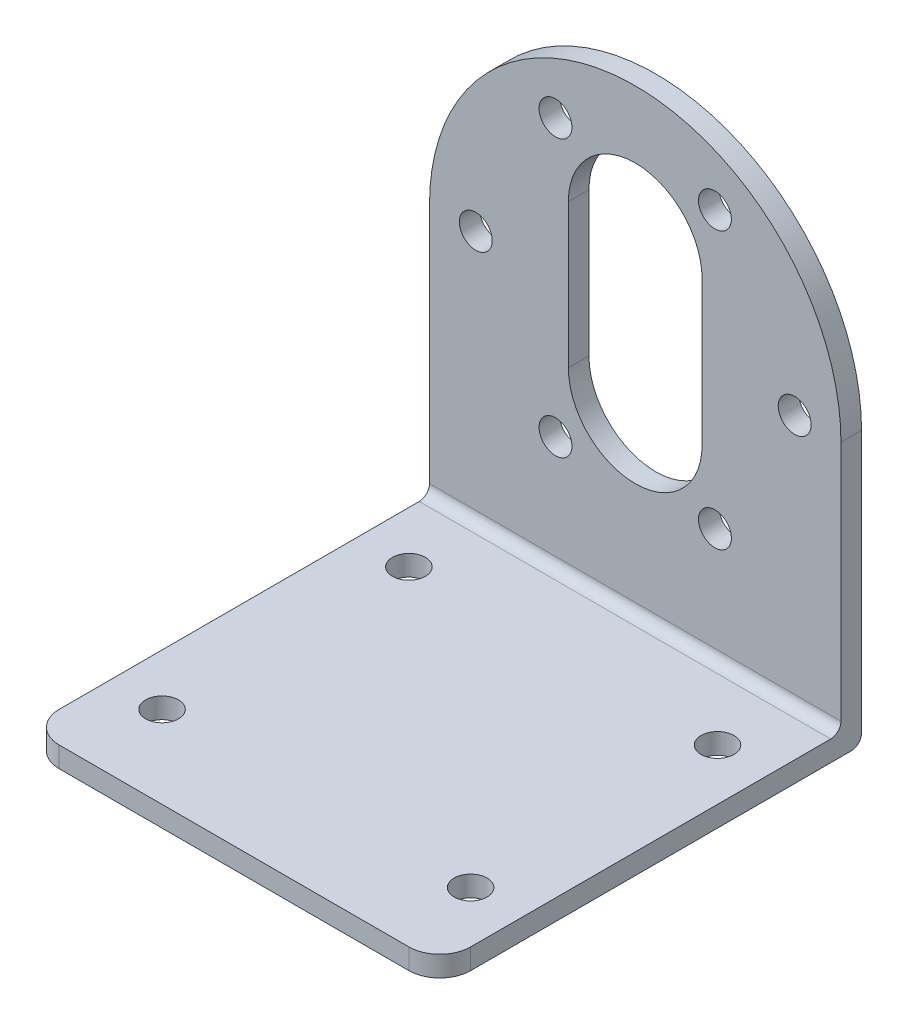
ISO-10303-21;
HEADER;
FILE_DESCRIPTION(('STEP AP214'),'2;1');
FILE_NAME('part.step','',(''),(''),'','','');
FILE_SCHEMA(('AUTOMOTIVE_DESIGN { 1 0 10303 214 1 1 1 1 }'));
ENDSEC;
DATA;
#1=APPLICATION_CONTEXT('core data for automotive mechanical design processes');
#2=APPLICATION_PROTOCOL_DEFINITION('international standard','automotive_design',2000,#1);
#3=PRODUCT_CONTEXT('',#1,'mechanical');
#4=PRODUCT('Part','Part','',(#3));
#5=PRODUCT_RELATED_PRODUCT_CATEGORY('part','',(#4));
#6=PRODUCT_DEFINITION_FORMATION('','',#4);
#7=PRODUCT_DEFINITION_CONTEXT('part definition',#1,'design');
#8=PRODUCT_DEFINITION('design','',#6,#7);
#9=PRODUCT_DEFINITION_SHAPE('','',#8);
#10=(LENGTH_UNIT() NAMED_UNIT(*) SI_UNIT(.MILLI.,.METRE.));
#11=(NAMED_UNIT(*) PLANE_ANGLE_UNIT() SI_UNIT($,.RADIAN.));
#12=(NAMED_UNIT(*) SI_UNIT($,.STERADIAN.) SOLID_ANGLE_UNIT());
#13=UNCERTAINTY_MEASURE_WITH_UNIT(LENGTH_MEASURE(1.E-05),#10,'distance_accuracy_value','');
#14=(GEOMETRIC_REPRESENTATION_CONTEXT(3) GLOBAL_UNCERTAINTY_ASSIGNED_CONTEXT((#13)) GLOBAL_UNIT_ASSIGNED_CONTEXT((#10,
#11,#12)) REPRESENTATION_CONTEXT('',''));
#15=CARTESIAN_POINT('',(0.,0.,0.));
#16=DIRECTION('',(0.,0.,1.));
#17=DIRECTION('',(1.,0.,0.));
#18=AXIS2_PLACEMENT_3D('',#15,#16,#17);
#19=CARTESIAN_POINT('',(0.,2.,0.));
#20=DIRECTION('',(0.,1.,0.));
#21=DIRECTION('',(0.,0.,1.));
#22=AXIS2_PLACEMENT_3D('',#19,#20,#21);
#23=PLANE('',#22);
#24=CARTESIAN_POINT('',(15.,2.,12.5));
#25=DIRECTION('',(0.,1.,0.));
#26=DIRECTION('',(0.,0.,1.));
#27=AXIS2_PLACEMENT_3D('',#24,#25,#26);
#28=CIRCLE('',#27,1.6);
#29=CARTESIAN_POINT('',(15.,2.,14.1));
#30=VERTEX_POINT('',#29);
#31=EDGE_CURVE('E184',#30,#30,#28,.T.);
#32=ORIENTED_EDGE('',*,*,#31,.F.);
#33=EDGE_LOOP('',(#32));
#34=FACE_BOUND('',#33,.T.);
#35=CARTESIAN_POINT('',(15.,2.,-11.5));
#36=DIRECTION('',(0.,1.,0.));
#37=DIRECTION('',(0.,0.,1.));
#38=AXIS2_PLACEMENT_3D('',#35,#36,#37);
#39=CIRCLE('',#38,1.6);
#40=CARTESIAN_POINT('',(15.,2.,-9.89999999999999));
#41=VERTEX_POINT('',#40);
#42=EDGE_CURVE('E191',#41,#41,#39,.T.);
#43=ORIENTED_EDGE('',*,*,#42,.F.);
#44=EDGE_LOOP('',(#43));
#45=FACE_BOUND('',#44,.T.);
#46=CARTESIAN_POINT('',(-15.,2.,-11.5));
#47=DIRECTION('',(0.,1.,0.));
#48=DIRECTION('',(0.,0.,1.));
#49=AXIS2_PLACEMENT_3D('',#46,#47,#48);
#50=CIRCLE('',#49,1.59999999999999);
#51=CARTESIAN_POINT('',(-15.,2.,-9.90000000000001));
#52=VERTEX_POINT('',#51);
#53=EDGE_CURVE('E187',#52,#52,#50,.T.);
#54=ORIENTED_EDGE('',*,*,#53,.F.);
#55=EDGE_LOOP('',(#54));
#56=FACE_BOUND('',#55,.T.);
#57=CARTESIAN_POINT('',(-15.,2.,12.5));
#58=DIRECTION('',(0.,1.,0.));
#59=DIRECTION('',(0.,0.,1.));
#60=AXIS2_PLACEMENT_3D('',#57,#58,#59);
#61=CIRCLE('',#60,1.6);
#62=CARTESIAN_POINT('',(-15.,2.,14.1));
#63=VERTEX_POINT('',#62);
#64=EDGE_CURVE('E190',#63,#63,#61,.T.);
#65=ORIENTED_EDGE('',*,*,#64,.F.);
#66=EDGE_LOOP('',(#65));
#67=FACE_BOUND('',#66,.T.);
#68=DIRECTION('',(0.,0.,-1.));
#69=VECTOR('',#68,1.);
#70=CARTESIAN_POINT('',(20.,2.,-20.5));
#71=LINE('',#70,#69);
#72=CARTESIAN_POINT('',(20.,2.,17.5));
#73=VERTEX_POINT('',#72);
#74=CARTESIAN_POINT('',(20.,2.,-17.5));
#75=VERTEX_POINT('',#74);
#76=EDGE_CURVE('E199',#73,#75,#71,.T.);
#77=ORIENTED_EDGE('',*,*,#76,.T.);
#78=DIRECTION('',(-1.,0.,0.));
#79=VECTOR('',#78,1.);
#80=CARTESIAN_POINT('',(0.,2.,-17.5));
#81=LINE('',#80,#79);
#82=CARTESIAN_POINT('',(-20.,2.,-17.5));
#83=VERTEX_POINT('',#82);
#84=EDGE_CURVE('E290',#75,#83,#81,.T.);
#85=ORIENTED_EDGE('',*,*,#84,.T.);
#86=DIRECTION('',(0.,0.,1.));
#87=VECTOR('',#86,1.);
#88=CARTESIAN_POINT('',(-20.,2.,-20.5));
#89=LINE('',#88,#87);
#90=CARTESIAN_POINT('',(-20.,2.,17.5));
#91=VERTEX_POINT('',#90);
#92=EDGE_CURVE('E202',#83,#91,#89,.T.);
#93=ORIENTED_EDGE('',*,*,#92,.T.);
#94=CARTESIAN_POINT('',(-17.,2.,17.5));
#95=DIRECTION('',(0.,1.,0.));
#96=DIRECTION('',(0.,0.,1.));
#97=AXIS2_PLACEMENT_3D('',#94,#95,#96);
#98=CIRCLE('',#97,3.);
#99=CARTESIAN_POINT('',(-17.,2.,20.5));
#100=VERTEX_POINT('',#99);
#101=EDGE_CURVE('E235',#91,#100,#98,.T.);
#102=ORIENTED_EDGE('',*,*,#101,.T.);
#103=DIRECTION('',(1.,0.,0.));
#104=VECTOR('',#103,1.);
#105=CARTESIAN_POINT('',(-20.,2.,20.5));
#106=LINE('',#105,#104);
#107=CARTESIAN_POINT('',(17.,2.,20.5));
#108=VERTEX_POINT('',#107);
#109=EDGE_CURVE('E205',#100,#108,#106,.T.);
#110=ORIENTED_EDGE('',*,*,#109,.T.);
#111=CARTESIAN_POINT('',(17.,2.,17.5));
#112=DIRECTION('',(0.,1.,0.));
#113=DIRECTION('',(0.,0.,1.));
#114=AXIS2_PLACEMENT_3D('',#111,#112,#113);
#115=CIRCLE('',#114,3.);
#116=EDGE_CURVE('E237',#108,#73,#115,.T.);
#117=ORIENTED_EDGE('',*,*,#116,.T.);
#118=EDGE_LOOP('',(#77,#85,#93,#102,#110,#117));
#119=FACE_BOUND('',#118,.T.);
#120=ADVANCED_FACE('F35',(#34,#45,#56,#67,#119),#23,.T.);
#121=CARTESIAN_POINT('',(20.,2.,-20.5));
#122=DIRECTION('',(-1.,0.,0.));
#123=DIRECTION('',(0.,0.,1.));
#124=AXIS2_PLACEMENT_3D('',#121,#122,#123);
#125=PLANE('',#124);
#126=DIRECTION('',(0.,0.,-1.));
#127=VECTOR('',#126,1.);
#128=CARTESIAN_POINT('',(20.,0.,-20.5));
#129=LINE('',#128,#127);
#130=CARTESIAN_POINT('',(20.,0.,17.5));
#131=VERTEX_POINT('',#130);
#132=CARTESIAN_POINT('',(20.,0.,-19.5));
#133=VERTEX_POINT('',#132);
#134=EDGE_CURVE('E209',#131,#133,#129,.T.);
#135=ORIENTED_EDGE('',*,*,#134,.T.);
#136=CARTESIAN_POINT('',(20.,1.,-19.5));
#137=DIRECTION('',(-1.,0.,0.));
#138=DIRECTION('',(0.,0.,1.));
#139=AXIS2_PLACEMENT_3D('',#136,#137,#138);
#140=CIRCLE('',#139,1.);
#141=CARTESIAN_POINT('',(20.,1.,-20.5));
#142=VERTEX_POINT('',#141);
#143=EDGE_CURVE('E288',#133,#142,#140,.F.);
#144=ORIENTED_EDGE('',*,*,#143,.T.);
#145=DIRECTION('',(0.,-1.,0.));
#146=VECTOR('',#145,1.);
#147=CARTESIAN_POINT('',(20.,2.,-20.5));
#148=LINE('',#147,#146);
#149=CARTESIAN_POINT('',(20.,26.5,-20.5));
#150=VERTEX_POINT('',#149);
#151=EDGE_CURVE('E219',#150,#142,#148,.T.);
#152=ORIENTED_EDGE('',*,*,#151,.F.);
#153=DIRECTION('',(0.,0.,-1.));
#154=VECTOR('',#153,1.);
#155=CARTESIAN_POINT('',(20.,26.5,-18.5));
#156=LINE('',#155,#154);
#157=CARTESIAN_POINT('',(20.,26.5,-18.5));
#158=VERTEX_POINT('',#157);
#159=EDGE_CURVE('E181',#158,#150,#156,.T.);
#160=ORIENTED_EDGE('',*,*,#159,.F.);
#161=DIRECTION('',(0.,-1.,0.));
#162=VECTOR('',#161,1.);
#163=CARTESIAN_POINT('',(20.,0.,-18.5));
#164=LINE('',#163,#162);
#165=CARTESIAN_POINT('',(20.,3.,-18.5));
#166=VERTEX_POINT('',#165);
#167=EDGE_CURVE('E171',#158,#166,#164,.T.);
#168=ORIENTED_EDGE('',*,*,#167,.T.);
#169=CARTESIAN_POINT('',(20.,3.,-17.5));
#170=DIRECTION('',(-1.,0.,0.));
#171=DIRECTION('',(0.,0.,1.));
#172=AXIS2_PLACEMENT_3D('',#169,#170,#171);
#173=CIRCLE('',#172,1.);
#174=EDGE_CURVE('E11',#166,#75,#173,.T.);
#175=ORIENTED_EDGE('',*,*,#174,.T.);
#176=ORIENTED_EDGE('',*,*,#76,.F.);
#177=DIRECTION('',(0.,-1.,0.));
#178=VECTOR('',#177,1.);
#179=CARTESIAN_POINT('',(20.,2.,17.5));
#180=LINE('',#179,#178);
#181=EDGE_CURVE('E222',#73,#131,#180,.T.);
#182=ORIENTED_EDGE('',*,*,#181,.T.);
#183=EDGE_LOOP('',(#135,#144,#152,#160,#168,#175,#176,#182));
#184=FACE_BOUND('',#183,.T.);
#185=ADVANCED_FACE('F315',(#184),#125,.F.);
#186=CARTESIAN_POINT('',(-20.,2.,-20.5));
#187=DIRECTION('',(0.,0.,1.));
#188=DIRECTION('',(1.,0.,0.));
#189=AXIS2_PLACEMENT_3D('',#186,#187,#188);
#190=PLANE('',#189);
#191=CARTESIAN_POINT('',(-7.75000000000015,13.0766062413413,-20.5));
#192=DIRECTION('',(0.,0.,-1.));
#193=DIRECTION('',(-0.50000000000001,-0.866025403784433,0.));
#194=AXIS2_PLACEMENT_3D('',#191,#192,#193);
#195=CIRCLE('',#194,1.6);
#196=CARTESIAN_POINT('',(-8.55000000000017,11.6909655952862,-20.5));
#197=VERTEX_POINT('',#196);
#198=EDGE_CURVE('E449',#197,#197,#195,.T.);
#199=ORIENTED_EDGE('',*,*,#198,.F.);
#200=EDGE_LOOP('',(#199));
#201=FACE_BOUND('',#200,.T.);
#202=CARTESIAN_POINT('',(7.74999999999988,13.0766062413411,-20.5));
#203=DIRECTION('',(0.,0.,-1.));
#204=DIRECTION('',(0.499999999999992,-0.866025403784443,0.));
#205=AXIS2_PLACEMENT_3D('',#202,#203,#204);
#206=CIRCLE('',#205,1.6);
#207=CARTESIAN_POINT('',(8.54999999999987,11.690965595286,-20.5));
#208=VERTEX_POINT('',#207);
#209=EDGE_CURVE('E452',#208,#208,#206,.T.);
#210=ORIENTED_EDGE('',*,*,#209,.F.);
#211=EDGE_LOOP('',(#210));
#212=FACE_BOUND('',#211,.T.);
#213=CARTESIAN_POINT('',(15.5,26.5,-20.5));
#214=DIRECTION('',(0.,0.,-1.));
#215=DIRECTION('',(1.,0.,0.));
#216=AXIS2_PLACEMENT_3D('',#213,#214,#215);
#217=CIRCLE('',#216,1.6);
#218=CARTESIAN_POINT('',(17.1,26.5,-20.5));
#219=VERTEX_POINT('',#218);
#220=EDGE_CURVE('E455',#219,#219,#217,.T.);
#221=ORIENTED_EDGE('',*,*,#220,.F.);
#222=EDGE_LOOP('',(#221));
#223=FACE_BOUND('',#222,.T.);
#224=CARTESIAN_POINT('',(7.75000000000007,39.9233937586588,-20.5));
#225=DIRECTION('',(0.,0.,-1.));
#226=DIRECTION('',(0.500000000000004,0.866025403784436,0.));
#227=AXIS2_PLACEMENT_3D('',#224,#225,#226);
#228=CIRCLE('',#227,1.6);
#229=CARTESIAN_POINT('',(8.55000000000008,41.3090344047139,-20.5));
#230=VERTEX_POINT('',#229);
#231=EDGE_CURVE('E429',#230,#230,#228,.T.);
#232=ORIENTED_EDGE('',*,*,#231,.F.);
#233=EDGE_LOOP('',(#232));
#234=FACE_BOUND('',#233,.T.);
#235=CARTESIAN_POINT('',(-7.74999999999996,39.9233937586588,-20.5));
#236=DIRECTION('',(0.,0.,-1.));
#237=DIRECTION('',(-0.499999999999998,0.86602540378444,0.));
#238=AXIS2_PLACEMENT_3D('',#235,#236,#237);
#239=CIRCLE('',#238,1.6);
#240=CARTESIAN_POINT('',(-8.54999999999996,41.3090344047139,-20.5));
#241=VERTEX_POINT('',#240);
#242=EDGE_CURVE('E270',#241,#241,#239,.T.);
#243=ORIENTED_EDGE('',*,*,#242,.F.);
#244=EDGE_LOOP('',(#243));
#245=FACE_BOUND('',#244,.T.);
#246=CARTESIAN_POINT('',(-15.5,26.5,-20.5));
#247=DIRECTION('',(0.,0.,-1.));
#248=DIRECTION('',(-1.,0.,0.));
#249=AXIS2_PLACEMENT_3D('',#246,#247,#248);
#250=CIRCLE('',#249,1.6);
#251=CARTESIAN_POINT('',(-17.1,26.5,-20.5));
#252=VERTEX_POINT('',#251);
#253=EDGE_CURVE('E265',#252,#252,#250,.T.);
#254=ORIENTED_EDGE('',*,*,#253,.F.);
#255=EDGE_LOOP('',(#254));
#256=FACE_BOUND('',#255,.T.);
#257=DIRECTION('',(0.,-1.,0.));
#258=VECTOR('',#257,1.);
#259=CARTESIAN_POINT('',(6.5,33.5,-20.5));
#260=LINE('',#259,#258);
#261=CARTESIAN_POINT('',(6.5,33.5,-20.5));
#262=VERTEX_POINT('',#261);
#263=CARTESIAN_POINT('',(6.5,19.5,-20.5));
#264=VERTEX_POINT('',#263);
#265=EDGE_CURVE('E151',#262,#264,#260,.T.);
#266=ORIENTED_EDGE('',*,*,#265,.F.);
#267=CARTESIAN_POINT('',(0.,33.5,-20.5));
#268=DIRECTION('',(0.,0.,-1.));
#269=DIRECTION('',(-1.,0.,0.));
#270=AXIS2_PLACEMENT_3D('',#267,#268,#269);
#271=CIRCLE('',#270,6.5);
#272=CARTESIAN_POINT('',(-6.5,33.5,-20.5));
#273=VERTEX_POINT('',#272);
#274=EDGE_CURVE('E156',#273,#262,#271,.T.);
#275=ORIENTED_EDGE('',*,*,#274,.F.);
#276=DIRECTION('',(0.,1.,0.));
#277=VECTOR('',#276,1.);
#278=CARTESIAN_POINT('',(-6.5,33.5,-20.5));
#279=LINE('',#278,#277);
#280=CARTESIAN_POINT('',(-6.5,19.5,-20.5));
#281=VERTEX_POINT('',#280);
#282=EDGE_CURVE('E161',#281,#273,#279,.T.);
#283=ORIENTED_EDGE('',*,*,#282,.F.);
#284=CARTESIAN_POINT('',(0.,19.5,-20.5));
#285=DIRECTION('',(0.,0.,-1.));
#286=DIRECTION('',(-1.,0.,0.));
#287=AXIS2_PLACEMENT_3D('',#284,#285,#286);
#288=CIRCLE('',#287,6.5);
#289=EDGE_CURVE('E140',#264,#281,#288,.T.);
#290=ORIENTED_EDGE('',*,*,#289,.F.);
#291=EDGE_LOOP('',(#266,#275,#283,#290));
#292=FACE_BOUND('',#291,.T.);
#293=ORIENTED_EDGE('',*,*,#151,.T.);
#294=DIRECTION('',(-1.,0.,0.));
#295=VECTOR('',#294,1.);
#296=CARTESIAN_POINT('',(-20.,1.,-20.5));
#297=LINE('',#296,#295);
#298=CARTESIAN_POINT('',(-20.,1.,-20.5));
#299=VERTEX_POINT('',#298);
#300=EDGE_CURVE('E261',#142,#299,#297,.T.);
#301=ORIENTED_EDGE('',*,*,#300,.T.);
#302=DIRECTION('',(0.,-1.,0.));
#303=VECTOR('',#302,1.);
#304=CARTESIAN_POINT('',(-20.,2.,-20.5));
#305=LINE('',#304,#303);
#306=CARTESIAN_POINT('',(-20.,26.5,-20.5));
#307=VERTEX_POINT('',#306);
#308=EDGE_CURVE('E208',#307,#299,#305,.T.);
#309=ORIENTED_EDGE('',*,*,#308,.F.);
#310=CARTESIAN_POINT('',(0.,26.5,-20.5));
#311=DIRECTION('',(0.,0.,-1.));
#312=DIRECTION('',(-1.,0.,0.));
#313=AXIS2_PLACEMENT_3D('',#310,#311,#312);
#314=CIRCLE('',#313,20.);
#315=EDGE_CURVE('E168',#307,#150,#314,.T.);
#316=ORIENTED_EDGE('',*,*,#315,.T.);
#317=EDGE_LOOP('',(#293,#301,#309,#316));
#318=FACE_BOUND('',#317,.T.);
#319=ADVANCED_FACE('F158',(#201,#212,#223,#234,#245,#256,#292,#318),#190,.F.);
#320=CARTESIAN_POINT('',(-20.,2.,-20.5));
#321=DIRECTION('',(1.,0.,0.));
#322=DIRECTION('',(0.,0.,-1.));
#323=AXIS2_PLACEMENT_3D('',#320,#321,#322);
#324=PLANE('',#323);
#325=ORIENTED_EDGE('',*,*,#308,.T.);
#326=CARTESIAN_POINT('',(-20.,1.,-19.5));
#327=DIRECTION('',(1.,0.,0.));
#328=DIRECTION('',(0.,0.,-1.));
#329=AXIS2_PLACEMENT_3D('',#326,#327,#328);
#330=CIRCLE('',#329,1.);
#331=CARTESIAN_POINT('',(-20.,0.,-19.5));
#332=VERTEX_POINT('',#331);
#333=EDGE_CURVE('E284',#299,#332,#330,.F.);
#334=ORIENTED_EDGE('',*,*,#333,.T.);
#335=DIRECTION('',(0.,0.,1.));
#336=VECTOR('',#335,1.);
#337=CARTESIAN_POINT('',(-20.,0.,-20.5));
#338=LINE('',#337,#336);
#339=CARTESIAN_POINT('',(-20.,0.,17.5));
#340=VERTEX_POINT('',#339);
#341=EDGE_CURVE('E212',#332,#340,#338,.T.);
#342=ORIENTED_EDGE('',*,*,#341,.T.);
#343=DIRECTION('',(0.,-1.,0.));
#344=VECTOR('',#343,1.);
#345=CARTESIAN_POINT('',(-20.,2.,17.5));
#346=LINE('',#345,#344);
#347=EDGE_CURVE('E239',#340,#91,#346,.F.);
#348=ORIENTED_EDGE('',*,*,#347,.T.);
#349=ORIENTED_EDGE('',*,*,#92,.F.);
#350=CARTESIAN_POINT('',(-20.,3.,-17.5));
#351=DIRECTION('',(1.,0.,0.));
#352=DIRECTION('',(0.,0.,-1.));
#353=AXIS2_PLACEMENT_3D('',#350,#351,#352);
#354=CIRCLE('',#353,1.);
#355=CARTESIAN_POINT('',(-20.,3.,-18.5));
#356=VERTEX_POINT('',#355);
#357=EDGE_CURVE('E43',#83,#356,#354,.T.);
#358=ORIENTED_EDGE('',*,*,#357,.T.);
#359=DIRECTION('',(0.,1.,0.));
#360=VECTOR('',#359,1.);
#361=CARTESIAN_POINT('',(-20.,0.,-18.5));
#362=LINE('',#361,#360);
#363=CARTESIAN_POINT('',(-20.,26.5,-18.5));
#364=VERTEX_POINT('',#363);
#365=EDGE_CURVE('E173',#356,#364,#362,.T.);
#366=ORIENTED_EDGE('',*,*,#365,.T.);
#367=DIRECTION('',(0.,0.,-1.));
#368=VECTOR('',#367,1.);
#369=CARTESIAN_POINT('',(-20.,26.5,-18.5));
#370=LINE('',#369,#368);
#371=EDGE_CURVE('E178',#364,#307,#370,.T.);
#372=ORIENTED_EDGE('',*,*,#371,.T.);
#373=EDGE_LOOP('',(#325,#334,#342,#348,#349,#358,#366,#372));
#374=FACE_BOUND('',#373,.T.);
#375=ADVANCED_FACE('F298',(#374),#324,.F.);
#376=CARTESIAN_POINT('',(-20.,2.,20.5));
#377=DIRECTION('',(0.,0.,-1.));
#378=DIRECTION('',(-1.,0.,0.));
#379=AXIS2_PLACEMENT_3D('',#376,#377,#378);
#380=PLANE('',#379);
#381=DIRECTION('',(1.,0.,0.));
#382=VECTOR('',#381,1.);
#383=CARTESIAN_POINT('',(-20.,0.,20.5));
#384=LINE('',#383,#382);
#385=CARTESIAN_POINT('',(-17.,0.,20.5));
#386=VERTEX_POINT('',#385);
#387=CARTESIAN_POINT('',(17.,0.,20.5));
#388=VERTEX_POINT('',#387);
#389=EDGE_CURVE('E203',#386,#388,#384,.T.);
#390=ORIENTED_EDGE('',*,*,#389,.T.);
#391=DIRECTION('',(0.,-1.,0.));
#392=VECTOR('',#391,1.);
#393=CARTESIAN_POINT('',(17.,2.,20.5));
#394=LINE('',#393,#392);
#395=EDGE_CURVE('E233',#388,#108,#394,.F.);
#396=ORIENTED_EDGE('',*,*,#395,.T.);
#397=ORIENTED_EDGE('',*,*,#109,.F.);
#398=DIRECTION('',(0.,-1.,0.));
#399=VECTOR('',#398,1.);
#400=CARTESIAN_POINT('',(-17.,2.,20.5));
#401=LINE('',#400,#399);
#402=EDGE_CURVE('E230',#100,#386,#401,.T.);
#403=ORIENTED_EDGE('',*,*,#402,.T.);
#404=EDGE_LOOP('',(#390,#396,#397,#403));
#405=FACE_BOUND('',#404,.T.);
#406=ADVANCED_FACE('F308',(#405),#380,.F.);
#407=CARTESIAN_POINT('',(0.,0.,0.));
#408=DIRECTION('',(0.,1.,0.));
#409=DIRECTION('',(0.,0.,1.));
#410=AXIS2_PLACEMENT_3D('',#407,#408,#409);
#411=PLANE('',#410);
#412=ORIENTED_EDGE('',*,*,#341,.F.);
#413=DIRECTION('',(-1.,0.,0.));
#414=VECTOR('',#413,1.);
#415=CARTESIAN_POINT('',(0.,0.,-19.5));
#416=LINE('',#415,#414);
#417=EDGE_CURVE('E286',#332,#133,#416,.F.);
#418=ORIENTED_EDGE('',*,*,#417,.T.);
#419=ORIENTED_EDGE('',*,*,#134,.F.);
#420=CARTESIAN_POINT('',(17.,0.,17.5));
#421=DIRECTION('',(0.,1.,0.));
#422=DIRECTION('',(0.,0.,1.));
#423=AXIS2_PLACEMENT_3D('',#420,#421,#422);
#424=CIRCLE('',#423,3.);
#425=EDGE_CURVE('E228',#131,#388,#424,.F.);
#426=ORIENTED_EDGE('',*,*,#425,.T.);
#427=ORIENTED_EDGE('',*,*,#389,.F.);
#428=CARTESIAN_POINT('',(-17.,0.,17.5));
#429=DIRECTION('',(0.,1.,0.));
#430=DIRECTION('',(0.,0.,1.));
#431=AXIS2_PLACEMENT_3D('',#428,#429,#430);
#432=CIRCLE('',#431,3.);
#433=EDGE_CURVE('E225',#386,#340,#432,.F.);
#434=ORIENTED_EDGE('',*,*,#433,.T.);
#435=EDGE_LOOP('',(#412,#418,#419,#426,#427,#434));
#436=FACE_BOUND('',#435,.T.);
#437=CARTESIAN_POINT('',(-15.,0.,12.5));
#438=DIRECTION('',(0.,1.,0.));
#439=DIRECTION('',(0.,0.,1.));
#440=AXIS2_PLACEMENT_3D('',#437,#438,#439);
#441=CIRCLE('',#440,1.6);
#442=CARTESIAN_POINT('',(-15.,0.,14.1));
#443=VERTEX_POINT('',#442);
#444=EDGE_CURVE('E198',#443,#443,#441,.T.);
#445=ORIENTED_EDGE('',*,*,#444,.T.);
#446=EDGE_LOOP('',(#445));
#447=FACE_BOUND('',#446,.T.);
#448=CARTESIAN_POINT('',(-15.,0.,-11.5));
#449=DIRECTION('',(0.,1.,0.));
#450=DIRECTION('',(0.,0.,1.));
#451=AXIS2_PLACEMENT_3D('',#448,#449,#450);
#452=CIRCLE('',#451,1.59999999999999);
#453=CARTESIAN_POINT('',(-15.,0.,-9.90000000000001));
#454=VERTEX_POINT('',#453);
#455=EDGE_CURVE('E245',#454,#454,#452,.T.);
#456=ORIENTED_EDGE('',*,*,#455,.T.);
#457=EDGE_LOOP('',(#456));
#458=FACE_BOUND('',#457,.T.);
#459=CARTESIAN_POINT('',(15.,0.,-11.5));
#460=DIRECTION('',(0.,1.,0.));
#461=DIRECTION('',(0.,0.,1.));
#462=AXIS2_PLACEMENT_3D('',#459,#460,#461);
#463=CIRCLE('',#462,1.6);
#464=CARTESIAN_POINT('',(15.,0.,-9.89999999999999));
#465=VERTEX_POINT('',#464);
#466=EDGE_CURVE('E248',#465,#465,#463,.T.);
#467=ORIENTED_EDGE('',*,*,#466,.T.);
#468=EDGE_LOOP('',(#467));
#469=FACE_BOUND('',#468,.T.);
#470=CARTESIAN_POINT('',(15.,0.,12.5));
#471=DIRECTION('',(0.,1.,0.));
#472=DIRECTION('',(0.,0.,1.));
#473=AXIS2_PLACEMENT_3D('',#470,#471,#472);
#474=CIRCLE('',#473,1.6);
#475=CARTESIAN_POINT('',(15.,0.,14.1));
#476=VERTEX_POINT('',#475);
#477=EDGE_CURVE('E213',#476,#476,#474,.T.);
#478=ORIENTED_EDGE('',*,*,#477,.T.);
#479=EDGE_LOOP('',(#478));
#480=FACE_BOUND('',#479,.T.);
#481=ADVANCED_FACE('F337',(#436,#447,#458,#469,#480),#411,.F.);
#482=CARTESIAN_POINT('',(17.,2.,17.5));
#483=DIRECTION('',(0.,-1.,0.));
#484=DIRECTION('',(0.,0.,-1.));
#485=AXIS2_PLACEMENT_3D('',#482,#483,#484);
#486=CYLINDRICAL_SURFACE('',#485,3.);
#487=ORIENTED_EDGE('',*,*,#116,.F.);
#488=ORIENTED_EDGE('',*,*,#395,.F.);
#489=ORIENTED_EDGE('',*,*,#425,.F.);
#490=ORIENTED_EDGE('',*,*,#181,.F.);
#491=EDGE_LOOP('',(#487,#488,#489,#490));
#492=FACE_BOUND('',#491,.T.);
#493=ADVANCED_FACE('F312',(#492),#486,.T.);
#494=CARTESIAN_POINT('',(-17.,2.,17.5));
#495=DIRECTION('',(0.,-1.,0.));
#496=DIRECTION('',(0.,0.,-1.));
#497=AXIS2_PLACEMENT_3D('',#494,#495,#496);
#498=CYLINDRICAL_SURFACE('',#497,3.);
#499=ORIENTED_EDGE('',*,*,#101,.F.);
#500=ORIENTED_EDGE('',*,*,#347,.F.);
#501=ORIENTED_EDGE('',*,*,#433,.F.);
#502=ORIENTED_EDGE('',*,*,#402,.F.);
#503=EDGE_LOOP('',(#499,#500,#501,#502));
#504=FACE_BOUND('',#503,.T.);
#505=ADVANCED_FACE('F304',(#504),#498,.T.);
#506=CARTESIAN_POINT('',(-15.,-48.,12.5));
#507=DIRECTION('',(0.,1.,0.));
#508=DIRECTION('',(0.,0.,1.));
#509=AXIS2_PLACEMENT_3D('',#506,#507,#508);
#510=CYLINDRICAL_SURFACE('',#509,1.6);
#511=ORIENTED_EDGE('',*,*,#64,.T.);
#512=EDGE_LOOP('',(#511));
#513=FACE_BOUND('',#512,.T.);
#514=ORIENTED_EDGE('',*,*,#444,.F.);
#515=EDGE_LOOP('',(#514));
#516=FACE_BOUND('',#515,.T.);
#517=ADVANCED_FACE('F335',(#513,#516),#510,.F.);
#518=CARTESIAN_POINT('',(-15.,-48.,-11.5));
#519=DIRECTION('',(0.,1.,0.));
#520=DIRECTION('',(0.,0.,1.));
#521=AXIS2_PLACEMENT_3D('',#518,#519,#520);
#522=CYLINDRICAL_SURFACE('',#521,1.59999999999999);
#523=ORIENTED_EDGE('',*,*,#53,.T.);
#524=EDGE_LOOP('',(#523));
#525=FACE_BOUND('',#524,.T.);
#526=ORIENTED_EDGE('',*,*,#455,.F.);
#527=EDGE_LOOP('',(#526));
#528=FACE_BOUND('',#527,.T.);
#529=ADVANCED_FACE('F354',(#525,#528),#522,.F.);
#530=CARTESIAN_POINT('',(15.,-48.,-11.5));
#531=DIRECTION('',(0.,1.,0.));
#532=DIRECTION('',(0.,0.,1.));
#533=AXIS2_PLACEMENT_3D('',#530,#531,#532);
#534=CYLINDRICAL_SURFACE('',#533,1.6);
#535=ORIENTED_EDGE('',*,*,#42,.T.);
#536=EDGE_LOOP('',(#535));
#537=FACE_BOUND('',#536,.T.);
#538=ORIENTED_EDGE('',*,*,#466,.F.);
#539=EDGE_LOOP('',(#538));
#540=FACE_BOUND('',#539,.T.);
#541=ADVANCED_FACE('F359',(#537,#540),#534,.F.);
#542=CARTESIAN_POINT('',(15.,-48.,12.5));
#543=DIRECTION('',(0.,1.,0.));
#544=DIRECTION('',(0.,0.,1.));
#545=AXIS2_PLACEMENT_3D('',#542,#543,#544);
#546=CYLINDRICAL_SURFACE('',#545,1.6);
#547=ORIENTED_EDGE('',*,*,#31,.T.);
#548=EDGE_LOOP('',(#547));
#549=FACE_BOUND('',#548,.T.);
#550=ORIENTED_EDGE('',*,*,#477,.F.);
#551=EDGE_LOOP('',(#550));
#552=FACE_BOUND('',#551,.T.);
#553=ADVANCED_FACE('F373',(#549,#552),#546,.F.);
#554=CARTESIAN_POINT('',(0.,26.5,-18.5));
#555=DIRECTION('',(0.,0.,-1.));
#556=DIRECTION('',(-1.,0.,0.));
#557=AXIS2_PLACEMENT_3D('',#554,#555,#556);
#558=CYLINDRICAL_SURFACE('',#557,20.);
#559=ORIENTED_EDGE('',*,*,#315,.F.);
#560=ORIENTED_EDGE('',*,*,#371,.F.);
#561=CARTESIAN_POINT('',(0.,26.5,-18.5));
#562=DIRECTION('',(0.,0.,-1.));
#563=DIRECTION('',(-1.,0.,0.));
#564=AXIS2_PLACEMENT_3D('',#561,#562,#563);
#565=CIRCLE('',#564,20.);
#566=EDGE_CURVE('E175',#364,#158,#565,.T.);
#567=ORIENTED_EDGE('',*,*,#566,.T.);
#568=ORIENTED_EDGE('',*,*,#159,.T.);
#569=EDGE_LOOP('',(#559,#560,#567,#568));
#570=FACE_BOUND('',#569,.T.);
#571=ADVANCED_FACE('F375',(#570),#558,.T.);
#572=CARTESIAN_POINT('',(0.,26.5,-18.5));
#573=DIRECTION('',(0.,0.,-1.));
#574=DIRECTION('',(-1.,0.,0.));
#575=AXIS2_PLACEMENT_3D('',#572,#573,#574);
#576=PLANE('',#575);
#577=CARTESIAN_POINT('',(-7.75000000000015,13.0766062413413,-18.5));
#578=DIRECTION('',(0.,0.,-1.));
#579=DIRECTION('',(-1.,0.,0.));
#580=AXIS2_PLACEMENT_3D('',#577,#578,#579);
#581=CIRCLE('',#580,1.6);
#582=CARTESIAN_POINT('',(-9.35000000000015,13.0766062413413,-18.5));
#583=VERTEX_POINT('',#582);
#584=EDGE_CURVE('E279',#583,#583,#581,.T.);
#585=ORIENTED_EDGE('',*,*,#584,.T.);
#586=EDGE_LOOP('',(#585));
#587=FACE_BOUND('',#586,.T.);
#588=CARTESIAN_POINT('',(7.74999999999988,13.0766062413411,-18.5));
#589=DIRECTION('',(0.,0.,-1.));
#590=DIRECTION('',(-1.,0.,0.));
#591=AXIS2_PLACEMENT_3D('',#588,#589,#590);
#592=CIRCLE('',#591,1.6);
#593=CARTESIAN_POINT('',(6.14999999999988,13.0766062413411,-18.5));
#594=VERTEX_POINT('',#593);
#595=EDGE_CURVE('E276',#594,#594,#592,.T.);
#596=ORIENTED_EDGE('',*,*,#595,.T.);
#597=EDGE_LOOP('',(#596));
#598=FACE_BOUND('',#597,.T.);
#599=CARTESIAN_POINT('',(15.5,26.5,-18.5));
#600=DIRECTION('',(0.,0.,-1.));
#601=DIRECTION('',(-1.,0.,0.));
#602=AXIS2_PLACEMENT_3D('',#599,#600,#601);
#603=CIRCLE('',#602,1.6);
#604=CARTESIAN_POINT('',(13.9,26.5,-18.5));
#605=VERTEX_POINT('',#604);
#606=EDGE_CURVE('E273',#605,#605,#603,.T.);
#607=ORIENTED_EDGE('',*,*,#606,.T.);
#608=EDGE_LOOP('',(#607));
#609=FACE_BOUND('',#608,.T.);
#610=CARTESIAN_POINT('',(7.75000000000007,39.9233937586588,-18.5));
#611=DIRECTION('',(0.,0.,-1.));
#612=DIRECTION('',(-1.,0.,0.));
#613=AXIS2_PLACEMENT_3D('',#610,#611,#612);
#614=CIRCLE('',#613,1.6);
#615=CARTESIAN_POINT('',(6.15000000000007,39.9233937586588,-18.5));
#616=VERTEX_POINT('',#615);
#617=EDGE_CURVE('E269',#616,#616,#614,.T.);
#618=ORIENTED_EDGE('',*,*,#617,.T.);
#619=EDGE_LOOP('',(#618));
#620=FACE_BOUND('',#619,.T.);
#621=CARTESIAN_POINT('',(-7.74999999999996,39.9233937586588,-18.5));
#622=DIRECTION('',(0.,0.,-1.));
#623=DIRECTION('',(-1.,0.,0.));
#624=AXIS2_PLACEMENT_3D('',#621,#622,#623);
#625=CIRCLE('',#624,1.6);
#626=CARTESIAN_POINT('',(-9.34999999999996,39.9233937586588,-18.5));
#627=VERTEX_POINT('',#626);
#628=EDGE_CURVE('E266',#627,#627,#625,.T.);
#629=ORIENTED_EDGE('',*,*,#628,.T.);
#630=EDGE_LOOP('',(#629));
#631=FACE_BOUND('',#630,.T.);
#632=CARTESIAN_POINT('',(-15.5,26.5,-18.5));
#633=DIRECTION('',(0.,0.,-1.));
#634=DIRECTION('',(-1.,0.,0.));
#635=AXIS2_PLACEMENT_3D('',#632,#633,#634);
#636=CIRCLE('',#635,1.6);
#637=CARTESIAN_POINT('',(-17.1,26.5,-18.5));
#638=VERTEX_POINT('',#637);
#639=EDGE_CURVE('E262',#638,#638,#636,.T.);
#640=ORIENTED_EDGE('',*,*,#639,.T.);
#641=EDGE_LOOP('',(#640));
#642=FACE_BOUND('',#641,.T.);
#643=DIRECTION('',(0.,1.,0.));
#644=VECTOR('',#643,1.);
#645=CARTESIAN_POINT('',(-6.5,26.5,-18.5));
#646=LINE('',#645,#644);
#647=CARTESIAN_POINT('',(-6.5,19.5,-18.5));
#648=VERTEX_POINT('',#647);
#649=CARTESIAN_POINT('',(-6.5,33.5,-18.5));
#650=VERTEX_POINT('',#649);
#651=EDGE_CURVE('E255',#648,#650,#646,.T.);
#652=ORIENTED_EDGE('',*,*,#651,.T.);
#653=CARTESIAN_POINT('',(0.,33.5,-18.5));
#654=DIRECTION('',(0.,0.,-1.));
#655=DIRECTION('',(-1.,0.,0.));
#656=AXIS2_PLACEMENT_3D('',#653,#654,#655);
#657=CIRCLE('',#656,6.5);
#658=CARTESIAN_POINT('',(6.5,33.5,-18.5));
#659=VERTEX_POINT('',#658);
#660=EDGE_CURVE('E258',#650,#659,#657,.T.);
#661=ORIENTED_EDGE('',*,*,#660,.T.);
#662=DIRECTION('',(0.,-1.,0.));
#663=VECTOR('',#662,1.);
#664=CARTESIAN_POINT('',(6.5,26.5,-18.5));
#665=LINE('',#664,#663);
#666=CARTESIAN_POINT('',(6.5,19.5,-18.5));
#667=VERTEX_POINT('',#666);
#668=EDGE_CURVE('E242',#659,#667,#665,.T.);
#669=ORIENTED_EDGE('',*,*,#668,.T.);
#670=CARTESIAN_POINT('',(0.,19.5,-18.5));
#671=DIRECTION('',(0.,0.,-1.));
#672=DIRECTION('',(-1.,0.,0.));
#673=AXIS2_PLACEMENT_3D('',#670,#671,#672);
#674=CIRCLE('',#673,6.5);
#675=EDGE_CURVE('E143',#667,#648,#674,.T.);
#676=ORIENTED_EDGE('',*,*,#675,.T.);
#677=EDGE_LOOP('',(#652,#661,#669,#676));
#678=FACE_BOUND('',#677,.T.);
#679=ORIENTED_EDGE('',*,*,#365,.F.);
#680=DIRECTION('',(-1.,0.,0.));
#681=VECTOR('',#680,1.);
#682=CARTESIAN_POINT('',(0.,3.,-18.5));
#683=LINE('',#682,#681);
#684=EDGE_CURVE('E56',#356,#166,#683,.F.);
#685=ORIENTED_EDGE('',*,*,#684,.T.);
#686=ORIENTED_EDGE('',*,*,#167,.F.);
#687=ORIENTED_EDGE('',*,*,#566,.F.);
#688=EDGE_LOOP('',(#679,#685,#686,#687));
#689=FACE_BOUND('',#688,.T.);
#690=ADVANCED_FACE('F381',(#587,#598,#609,#620,#631,#642,#678,#689),#576,.F.);
#691=CARTESIAN_POINT('',(0.,33.5,29.5));
#692=DIRECTION('',(0.,0.,-1.));
#693=DIRECTION('',(-1.,0.,0.));
#694=AXIS2_PLACEMENT_3D('',#691,#692,#693);
#695=CYLINDRICAL_SURFACE('',#694,6.5);
#696=DIRECTION('',(0.,0.,-1.));
#697=VECTOR('',#696,1.);
#698=CARTESIAN_POINT('',(-6.5,33.5,29.5));
#699=LINE('',#698,#697);
#700=EDGE_CURVE('E166',#650,#273,#699,.T.);
#701=ORIENTED_EDGE('',*,*,#700,.T.);
#702=ORIENTED_EDGE('',*,*,#274,.T.);
#703=DIRECTION('',(0.,0.,-1.));
#704=VECTOR('',#703,1.);
#705=CARTESIAN_POINT('',(6.5,33.5,29.5));
#706=LINE('',#705,#704);
#707=EDGE_CURVE('E147',#659,#262,#706,.T.);
#708=ORIENTED_EDGE('',*,*,#707,.F.);
#709=ORIENTED_EDGE('',*,*,#660,.F.);
#710=EDGE_LOOP('',(#701,#702,#708,#709));
#711=FACE_BOUND('',#710,.T.);
#712=ADVANCED_FACE('F389',(#711),#695,.F.);
#713=CARTESIAN_POINT('',(-6.5,33.5,29.5));
#714=DIRECTION('',(-1.,0.,0.));
#715=DIRECTION('',(0.,-1.,0.));
#716=AXIS2_PLACEMENT_3D('',#713,#714,#715);
#717=PLANE('',#716);
#718=DIRECTION('',(0.,0.,-1.));
#719=VECTOR('',#718,1.);
#720=CARTESIAN_POINT('',(-6.5,19.5,29.5));
#721=LINE('',#720,#719);
#722=EDGE_CURVE('E146',#648,#281,#721,.T.);
#723=ORIENTED_EDGE('',*,*,#722,.T.);
#724=ORIENTED_EDGE('',*,*,#282,.T.);
#725=ORIENTED_EDGE('',*,*,#700,.F.);
#726=ORIENTED_EDGE('',*,*,#651,.F.);
#727=EDGE_LOOP('',(#723,#724,#725,#726));
#728=FACE_BOUND('',#727,.T.);
#729=ADVANCED_FACE('F393',(#728),#717,.F.);
#730=CARTESIAN_POINT('',(0.,19.5,29.5));
#731=DIRECTION('',(0.,0.,-1.));
#732=DIRECTION('',(-1.,0.,0.));
#733=AXIS2_PLACEMENT_3D('',#730,#731,#732);
#734=CYLINDRICAL_SURFACE('',#733,6.5);
#735=DIRECTION('',(0.,0.,-1.));
#736=VECTOR('',#735,1.);
#737=CARTESIAN_POINT('',(6.5,19.5,29.5));
#738=LINE('',#737,#736);
#739=EDGE_CURVE('E135',#667,#264,#738,.T.);
#740=ORIENTED_EDGE('',*,*,#739,.T.);
#741=ORIENTED_EDGE('',*,*,#289,.T.);
#742=ORIENTED_EDGE('',*,*,#722,.F.);
#743=ORIENTED_EDGE('',*,*,#675,.F.);
#744=EDGE_LOOP('',(#740,#741,#742,#743));
#745=FACE_BOUND('',#744,.T.);
#746=ADVANCED_FACE('F137',(#745),#734,.F.);
#747=CARTESIAN_POINT('',(6.5,33.5,29.5));
#748=DIRECTION('',(1.,0.,0.));
#749=DIRECTION('',(0.,1.,0.));
#750=AXIS2_PLACEMENT_3D('',#747,#748,#749);
#751=PLANE('',#750);
#752=ORIENTED_EDGE('',*,*,#707,.T.);
#753=ORIENTED_EDGE('',*,*,#265,.T.);
#754=ORIENTED_EDGE('',*,*,#739,.F.);
#755=ORIENTED_EDGE('',*,*,#668,.F.);
#756=EDGE_LOOP('',(#752,#753,#754,#755));
#757=FACE_BOUND('',#756,.T.);
#758=ADVANCED_FACE('F152',(#757),#751,.F.);
#759=CARTESIAN_POINT('',(-15.5,26.5,29.5));
#760=DIRECTION('',(0.,0.,-1.));
#761=DIRECTION('',(-1.,0.,0.));
#762=AXIS2_PLACEMENT_3D('',#759,#760,#761);
#763=CYLINDRICAL_SURFACE('',#762,1.6);
#764=ORIENTED_EDGE('',*,*,#253,.T.);
#765=EDGE_LOOP('',(#764));
#766=FACE_BOUND('',#765,.T.);
#767=ORIENTED_EDGE('',*,*,#639,.F.);
#768=EDGE_LOOP('',(#767));
#769=FACE_BOUND('',#768,.T.);
#770=ADVANCED_FACE('F397',(#766,#769),#763,.F.);
#771=CARTESIAN_POINT('',(-7.74999999999996,39.9233937586588,29.5));
#772=DIRECTION('',(0.,0.,-1.));
#773=DIRECTION('',(-1.,0.,0.));
#774=AXIS2_PLACEMENT_3D('',#771,#772,#773);
#775=CYLINDRICAL_SURFACE('',#774,1.6);
#776=ORIENTED_EDGE('',*,*,#242,.T.);
#777=EDGE_LOOP('',(#776));
#778=FACE_BOUND('',#777,.T.);
#779=ORIENTED_EDGE('',*,*,#628,.F.);
#780=EDGE_LOOP('',(#779));
#781=FACE_BOUND('',#780,.T.);
#782=ADVANCED_FACE('F405',(#778,#781),#775,.F.);
#783=CARTESIAN_POINT('',(7.75000000000007,39.9233937586588,29.5));
#784=DIRECTION('',(0.,0.,-1.));
#785=DIRECTION('',(-1.,0.,0.));
#786=AXIS2_PLACEMENT_3D('',#783,#784,#785);
#787=CYLINDRICAL_SURFACE('',#786,1.6);
#788=ORIENTED_EDGE('',*,*,#231,.T.);
#789=EDGE_LOOP('',(#788));
#790=FACE_BOUND('',#789,.T.);
#791=ORIENTED_EDGE('',*,*,#617,.F.);
#792=EDGE_LOOP('',(#791));
#793=FACE_BOUND('',#792,.T.);
#794=ADVANCED_FACE('F409',(#790,#793),#787,.F.);
#795=CARTESIAN_POINT('',(15.5,26.5,29.5));
#796=DIRECTION('',(0.,0.,-1.));
#797=DIRECTION('',(-1.,0.,0.));
#798=AXIS2_PLACEMENT_3D('',#795,#796,#797);
#799=CYLINDRICAL_SURFACE('',#798,1.6);
#800=ORIENTED_EDGE('',*,*,#220,.T.);
#801=EDGE_LOOP('',(#800));
#802=FACE_BOUND('',#801,.T.);
#803=ORIENTED_EDGE('',*,*,#606,.F.);
#804=EDGE_LOOP('',(#803));
#805=FACE_BOUND('',#804,.T.);
#806=ADVANCED_FACE('F417',(#802,#805),#799,.F.);
#807=CARTESIAN_POINT('',(7.74999999999988,13.0766062413411,29.5));
#808=DIRECTION('',(0.,0.,-1.));
#809=DIRECTION('',(-1.,0.,0.));
#810=AXIS2_PLACEMENT_3D('',#807,#808,#809);
#811=CYLINDRICAL_SURFACE('',#810,1.6);
#812=ORIENTED_EDGE('',*,*,#209,.T.);
#813=EDGE_LOOP('',(#812));
#814=FACE_BOUND('',#813,.T.);
#815=ORIENTED_EDGE('',*,*,#595,.F.);
#816=EDGE_LOOP('',(#815));
#817=FACE_BOUND('',#816,.T.);
#818=ADVANCED_FACE('F413',(#814,#817),#811,.F.);
#819=CARTESIAN_POINT('',(-7.75000000000015,13.0766062413413,29.5));
#820=DIRECTION('',(0.,0.,-1.));
#821=DIRECTION('',(-1.,0.,0.));
#822=AXIS2_PLACEMENT_3D('',#819,#820,#821);
#823=CYLINDRICAL_SURFACE('',#822,1.6);
#824=ORIENTED_EDGE('',*,*,#198,.T.);
#825=EDGE_LOOP('',(#824));
#826=FACE_BOUND('',#825,.T.);
#827=ORIENTED_EDGE('',*,*,#584,.F.);
#828=EDGE_LOOP('',(#827));
#829=FACE_BOUND('',#828,.T.);
#830=ADVANCED_FACE('F322',(#826,#829),#823,.F.);
#831=CARTESIAN_POINT('',(-20.,1.,-19.5));
#832=DIRECTION('',(-1.,0.,0.));
#833=DIRECTION('',(0.,0.,1.));
#834=AXIS2_PLACEMENT_3D('',#831,#832,#833);
#835=CYLINDRICAL_SURFACE('',#834,1.);
#836=ORIENTED_EDGE('',*,*,#143,.F.);
#837=ORIENTED_EDGE('',*,*,#417,.F.);
#838=ORIENTED_EDGE('',*,*,#333,.F.);
#839=ORIENTED_EDGE('',*,*,#300,.F.);
#840=EDGE_LOOP('',(#836,#837,#838,#839));
#841=FACE_BOUND('',#840,.T.);
#842=ADVANCED_FACE('F318',(#841),#835,.T.);
#843=CARTESIAN_POINT('',(0.,3.,-17.5));
#844=DIRECTION('',(-1.,0.,0.));
#845=DIRECTION('',(0.,0.,1.));
#846=AXIS2_PLACEMENT_3D('',#843,#844,#845);
#847=CYLINDRICAL_SURFACE('',#846,1.);
#848=ORIENTED_EDGE('',*,*,#174,.F.);
#849=ORIENTED_EDGE('',*,*,#684,.F.);
#850=ORIENTED_EDGE('',*,*,#357,.F.);
#851=ORIENTED_EDGE('',*,*,#84,.F.);
#852=EDGE_LOOP('',(#848,#849,#850,#851));
#853=FACE_BOUND('',#852,.T.);
#854=ADVANCED_FACE('F37',(#853),#847,.F.);
#855=CLOSED_SHELL('',(#120,#185,#319,#375,#406,#481,#493,#505,#517,#529,#541,#553,#571,#690,
#712,#729,#746,#758,#770,#782,#794,#806,#818,#830,#842,#854));
#856=MANIFOLD_SOLID_BREP('B2',#855);
#857=ADVANCED_BREP_SHAPE_REPRESENTATION('',(#18,#856),#14);
#858=SHAPE_DEFINITION_REPRESENTATION(#9,#857);
ENDSEC;
END-ISO-10303-21;
